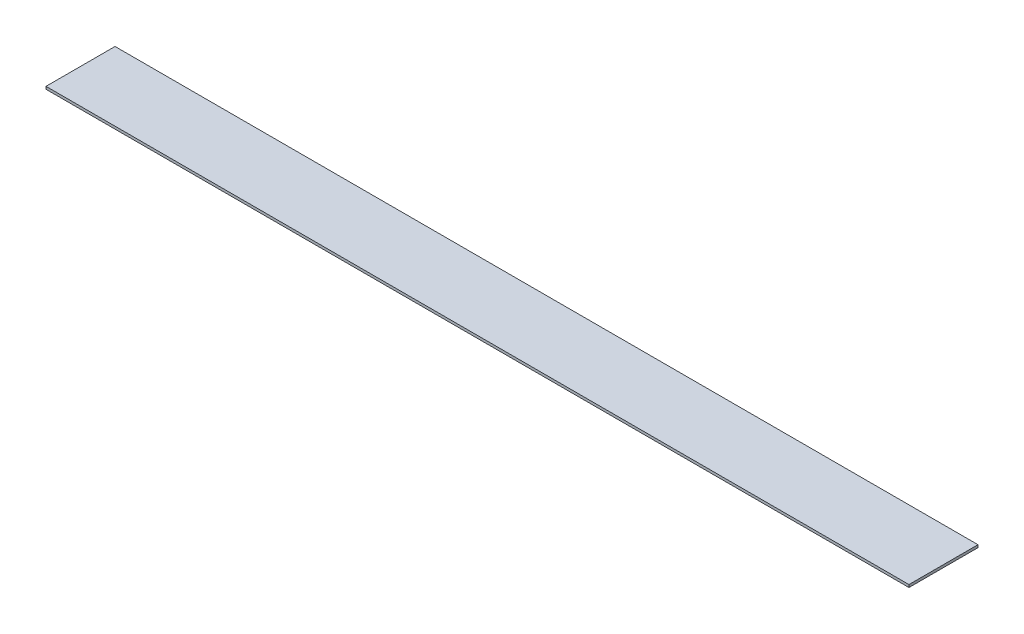
ISO-10303-21;
HEADER;
FILE_DESCRIPTION(('STEP AP214'),'2;1');
FILE_NAME('part.step','',(''),(''),'','','');
FILE_SCHEMA(('AUTOMOTIVE_DESIGN { 1 0 10303 214 1 1 1 1 }'));
ENDSEC;
DATA;
#1=APPLICATION_CONTEXT('core data for automotive mechanical design processes');
#2=APPLICATION_PROTOCOL_DEFINITION('international standard','automotive_design',2000,#1);
#3=PRODUCT_CONTEXT('',#1,'mechanical');
#4=PRODUCT('Part','Part','',(#3));
#5=PRODUCT_RELATED_PRODUCT_CATEGORY('part','',(#4));
#6=PRODUCT_DEFINITION_FORMATION('','',#4);
#7=PRODUCT_DEFINITION_CONTEXT('part definition',#1,'design');
#8=PRODUCT_DEFINITION('design','',#6,#7);
#9=PRODUCT_DEFINITION_SHAPE('','',#8);
#10=(LENGTH_UNIT() NAMED_UNIT(*) SI_UNIT(.MILLI.,.METRE.));
#11=(NAMED_UNIT(*) PLANE_ANGLE_UNIT() SI_UNIT($,.RADIAN.));
#12=(NAMED_UNIT(*) SI_UNIT($,.STERADIAN.) SOLID_ANGLE_UNIT());
#13=UNCERTAINTY_MEASURE_WITH_UNIT(LENGTH_MEASURE(1.E-05),#10,'distance_accuracy_value','');
#14=(GEOMETRIC_REPRESENTATION_CONTEXT(3) GLOBAL_UNCERTAINTY_ASSIGNED_CONTEXT((#13)) GLOBAL_UNIT_ASSIGNED_CONTEXT((#10,
#11,#12)) REPRESENTATION_CONTEXT('',''));
#15=CARTESIAN_POINT('',(0.,0.,0.));
#16=DIRECTION('',(0.,0.,1.));
#17=DIRECTION('',(1.,0.,0.));
#18=AXIS2_PLACEMENT_3D('',#15,#16,#17);
#19=CARTESIAN_POINT('',(-250.,1.5,-20.));
#20=DIRECTION('',(1.,0.,0.));
#21=DIRECTION('',(0.,0.,-1.));
#22=AXIS2_PLACEMENT_3D('',#19,#20,#21);
#23=PLANE('',#22);
#24=DIRECTION('',(0.,0.,1.));
#25=VECTOR('',#24,1.);
#26=CARTESIAN_POINT('',(-250.,0.,-20.));
#27=LINE('',#26,#25);
#28=CARTESIAN_POINT('',(-250.,0.,-20.));
#29=VERTEX_POINT('',#28);
#30=CARTESIAN_POINT('',(-250.,0.,20.));
#31=VERTEX_POINT('',#30);
#32=EDGE_CURVE('E98',#29,#31,#27,.T.);
#33=ORIENTED_EDGE('',*,*,#32,.T.);
#34=DIRECTION('',(0.,-1.,0.));
#35=VECTOR('',#34,1.);
#36=CARTESIAN_POINT('',(-250.,1.5,20.));
#37=LINE('',#36,#35);
#38=CARTESIAN_POINT('',(-250.,1.5,20.));
#39=VERTEX_POINT('',#38);
#40=EDGE_CURVE('E11',#39,#31,#37,.T.);
#41=ORIENTED_EDGE('',*,*,#40,.F.);
#42=DIRECTION('',(0.,0.,1.));
#43=VECTOR('',#42,1.);
#44=CARTESIAN_POINT('',(-250.,1.5,-20.));
#45=LINE('',#44,#43);
#46=CARTESIAN_POINT('',(-250.,1.5,-20.));
#47=VERTEX_POINT('',#46);
#48=EDGE_CURVE('E86',#47,#39,#45,.T.);
#49=ORIENTED_EDGE('',*,*,#48,.F.);
#50=DIRECTION('',(0.,-1.,0.));
#51=VECTOR('',#50,1.);
#52=CARTESIAN_POINT('',(-250.,1.5,-20.));
#53=LINE('',#52,#51);
#54=EDGE_CURVE('E94',#47,#29,#53,.T.);
#55=ORIENTED_EDGE('',*,*,#54,.T.);
#56=EDGE_LOOP('',(#33,#41,#49,#55));
#57=FACE_BOUND('',#56,.T.);
#58=ADVANCED_FACE('F35',(#57),#23,.F.);
#59=CARTESIAN_POINT('',(-250.,1.5,20.));
#60=DIRECTION('',(0.,0.,-1.));
#61=DIRECTION('',(-1.,0.,0.));
#62=AXIS2_PLACEMENT_3D('',#59,#60,#61);
#63=PLANE('',#62);
#64=DIRECTION('',(1.,0.,0.));
#65=VECTOR('',#64,1.);
#66=CARTESIAN_POINT('',(-250.,0.,20.));
#67=LINE('',#66,#65);
#68=CARTESIAN_POINT('',(250.,0.,20.));
#69=VERTEX_POINT('',#68);
#70=EDGE_CURVE('E90',#31,#69,#67,.T.);
#71=ORIENTED_EDGE('',*,*,#70,.T.);
#72=DIRECTION('',(0.,-1.,0.));
#73=VECTOR('',#72,1.);
#74=CARTESIAN_POINT('',(250.,1.5,20.));
#75=LINE('',#74,#73);
#76=CARTESIAN_POINT('',(250.,1.5,20.));
#77=VERTEX_POINT('',#76);
#78=EDGE_CURVE('E43',#77,#69,#75,.T.);
#79=ORIENTED_EDGE('',*,*,#78,.F.);
#80=DIRECTION('',(1.,0.,0.));
#81=VECTOR('',#80,1.);
#82=CARTESIAN_POINT('',(-250.,1.5,20.));
#83=LINE('',#82,#81);
#84=EDGE_CURVE('E81',#39,#77,#83,.T.);
#85=ORIENTED_EDGE('',*,*,#84,.F.);
#86=ORIENTED_EDGE('',*,*,#40,.T.);
#87=EDGE_LOOP('',(#71,#79,#85,#86));
#88=FACE_BOUND('',#87,.T.);
#89=ADVANCED_FACE('F89',(#88),#63,.F.);
#90=CARTESIAN_POINT('',(250.,1.5,-20.));
#91=DIRECTION('',(-1.,0.,0.));
#92=DIRECTION('',(0.,0.,1.));
#93=AXIS2_PLACEMENT_3D('',#90,#91,#92);
#94=PLANE('',#93);
#95=DIRECTION('',(0.,0.,-1.));
#96=VECTOR('',#95,1.);
#97=CARTESIAN_POINT('',(250.,0.,-20.));
#98=LINE('',#97,#96);
#99=CARTESIAN_POINT('',(250.,0.,-20.));
#100=VERTEX_POINT('',#99);
#101=EDGE_CURVE('E68',#69,#100,#98,.T.);
#102=ORIENTED_EDGE('',*,*,#101,.T.);
#103=DIRECTION('',(0.,-1.,0.));
#104=VECTOR('',#103,1.);
#105=CARTESIAN_POINT('',(250.,1.5,-20.));
#106=LINE('',#105,#104);
#107=CARTESIAN_POINT('',(250.,1.5,-20.));
#108=VERTEX_POINT('',#107);
#109=EDGE_CURVE('E91',#108,#100,#106,.T.);
#110=ORIENTED_EDGE('',*,*,#109,.F.);
#111=DIRECTION('',(0.,0.,-1.));
#112=VECTOR('',#111,1.);
#113=CARTESIAN_POINT('',(250.,1.5,-20.));
#114=LINE('',#113,#112);
#115=EDGE_CURVE('E84',#77,#108,#114,.T.);
#116=ORIENTED_EDGE('',*,*,#115,.F.);
#117=ORIENTED_EDGE('',*,*,#78,.T.);
#118=EDGE_LOOP('',(#102,#110,#116,#117));
#119=FACE_BOUND('',#118,.T.);
#120=ADVANCED_FACE('F92',(#119),#94,.F.);
#121=CARTESIAN_POINT('',(-250.,1.5,-20.));
#122=DIRECTION('',(0.,0.,1.));
#123=DIRECTION('',(1.,0.,0.));
#124=AXIS2_PLACEMENT_3D('',#121,#122,#123);
#125=PLANE('',#124);
#126=DIRECTION('',(-1.,0.,0.));
#127=VECTOR('',#126,1.);
#128=CARTESIAN_POINT('',(-250.,0.,-20.));
#129=LINE('',#128,#127);
#130=EDGE_CURVE('E74',#100,#29,#129,.T.);
#131=ORIENTED_EDGE('',*,*,#130,.T.);
#132=ORIENTED_EDGE('',*,*,#54,.F.);
#133=DIRECTION('',(-1.,0.,0.));
#134=VECTOR('',#133,1.);
#135=CARTESIAN_POINT('',(-250.,1.5,-20.));
#136=LINE('',#135,#134);
#137=EDGE_CURVE('E51',#108,#47,#136,.T.);
#138=ORIENTED_EDGE('',*,*,#137,.F.);
#139=ORIENTED_EDGE('',*,*,#109,.T.);
#140=EDGE_LOOP('',(#131,#132,#138,#139));
#141=FACE_BOUND('',#140,.T.);
#142=ADVANCED_FACE('F105',(#141),#125,.F.);
#143=CARTESIAN_POINT('',(0.,1.5,0.));
#144=DIRECTION('',(0.,1.,0.));
#145=DIRECTION('',(0.,0.,1.));
#146=AXIS2_PLACEMENT_3D('',#143,#144,#145);
#147=PLANE('',#146);
#148=ORIENTED_EDGE('',*,*,#48,.T.);
#149=ORIENTED_EDGE('',*,*,#84,.T.);
#150=ORIENTED_EDGE('',*,*,#115,.T.);
#151=ORIENTED_EDGE('',*,*,#137,.T.);
#152=EDGE_LOOP('',(#148,#149,#150,#151));
#153=FACE_BOUND('',#152,.T.);
#154=ADVANCED_FACE('F82',(#153),#147,.T.);
#155=CARTESIAN_POINT('',(0.,0.,0.));
#156=DIRECTION('',(0.,1.,0.));
#157=DIRECTION('',(0.,0.,1.));
#158=AXIS2_PLACEMENT_3D('',#155,#156,#157);
#159=PLANE('',#158);
#160=ORIENTED_EDGE('',*,*,#32,.F.);
#161=ORIENTED_EDGE('',*,*,#130,.F.);
#162=ORIENTED_EDGE('',*,*,#101,.F.);
#163=ORIENTED_EDGE('',*,*,#70,.F.);
#164=EDGE_LOOP('',(#160,#161,#162,#163));
#165=FACE_BOUND('',#164,.T.);
#166=ADVANCED_FACE('F108',(#165),#159,.F.);
#167=CLOSED_SHELL('',(#58,#89,#120,#142,#154,#166));
#168=MANIFOLD_SOLID_BREP('B2',#167);
#169=ADVANCED_BREP_SHAPE_REPRESENTATION('',(#18,#168),#14);
#170=SHAPE_DEFINITION_REPRESENTATION(#9,#169);
ENDSEC;
END-ISO-10303-21;
